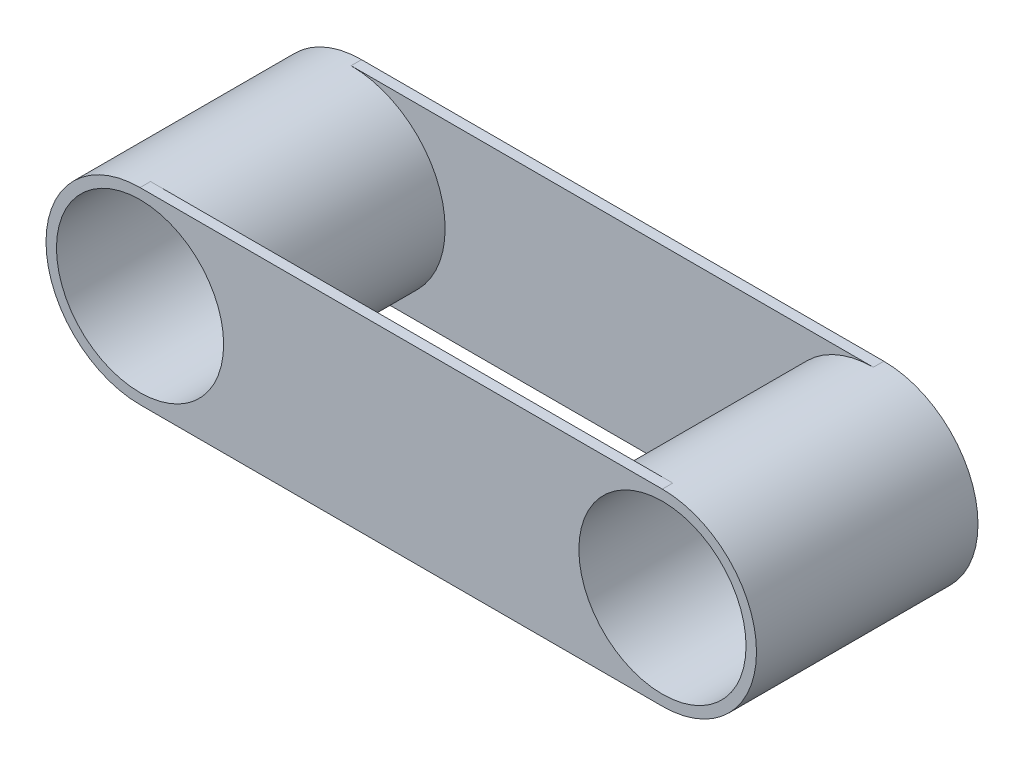
ISO-10303-21;
HEADER;
FILE_DESCRIPTION(('STEP AP214'),'2;1');
FILE_NAME('part.step','',(''),(''),'','','');
FILE_SCHEMA(('AUTOMOTIVE_DESIGN { 1 0 10303 214 1 1 1 1 }'));
ENDSEC;
DATA;
#1=APPLICATION_CONTEXT('core data for automotive mechanical design processes');
#2=APPLICATION_PROTOCOL_DEFINITION('international standard','automotive_design',2000,#1);
#3=PRODUCT_CONTEXT('',#1,'mechanical');
#4=PRODUCT('Part','Part','',(#3));
#5=PRODUCT_RELATED_PRODUCT_CATEGORY('part','',(#4));
#6=PRODUCT_DEFINITION_FORMATION('','',#4);
#7=PRODUCT_DEFINITION_CONTEXT('part definition',#1,'design');
#8=PRODUCT_DEFINITION('design','',#6,#7);
#9=PRODUCT_DEFINITION_SHAPE('','',#8);
#10=(LENGTH_UNIT() NAMED_UNIT(*) SI_UNIT(.MILLI.,.METRE.));
#11=(NAMED_UNIT(*) PLANE_ANGLE_UNIT() SI_UNIT($,.RADIAN.));
#12=(NAMED_UNIT(*) SI_UNIT($,.STERADIAN.) SOLID_ANGLE_UNIT());
#13=UNCERTAINTY_MEASURE_WITH_UNIT(LENGTH_MEASURE(1.E-05),#10,'distance_accuracy_value','');
#14=(GEOMETRIC_REPRESENTATION_CONTEXT(3) GLOBAL_UNCERTAINTY_ASSIGNED_CONTEXT((#13)) GLOBAL_UNIT_ASSIGNED_CONTEXT((#10,
#11,#12)) REPRESENTATION_CONTEXT('',''));
#15=CARTESIAN_POINT('',(0.,0.,0.));
#16=DIRECTION('',(0.,0.,1.));
#17=DIRECTION('',(1.,0.,0.));
#18=AXIS2_PLACEMENT_3D('',#15,#16,#17);
#19=CARTESIAN_POINT('',(499.88,90.,96.));
#20=DIRECTION('',(-1.,0.,0.));
#21=DIRECTION('',(0.,0.,1.));
#22=AXIS2_PLACEMENT_3D('',#19,#20,#21);
#23=PLANE('',#22);
#24=DIRECTION('',(0.,-1.,0.));
#25=VECTOR('',#24,1.);
#26=CARTESIAN_POINT('',(499.88,90.,106.));
#27=LINE('',#26,#25);
#28=CARTESIAN_POINT('',(499.88,90.,106.));
#29=VERTEX_POINT('',#28);
#30=CARTESIAN_POINT('',(499.88,89.9999199999645,106.));
#31=VERTEX_POINT('',#30);
#32=EDGE_CURVE('E59',#29,#31,#27,.T.);
#33=ORIENTED_EDGE('',*,*,#32,.T.);
#34=DIRECTION('',(0.,0.,-1.));
#35=VECTOR('',#34,1.);
#36=CARTESIAN_POINT('',(499.88,89.9999199999645,106.));
#37=LINE('',#36,#35);
#38=CARTESIAN_POINT('',(499.88,89.9999199999644,96.));
#39=VERTEX_POINT('',#38);
#40=EDGE_CURVE('E164',#31,#39,#37,.T.);
#41=ORIENTED_EDGE('',*,*,#40,.T.);
#42=DIRECTION('',(0.,-1.,0.));
#43=VECTOR('',#42,1.);
#44=CARTESIAN_POINT('',(499.88,90.,96.));
#45=LINE('',#44,#43);
#46=CARTESIAN_POINT('',(499.88,90.,96.));
#47=VERTEX_POINT('',#46);
#48=EDGE_CURVE('E182',#47,#39,#45,.T.);
#49=ORIENTED_EDGE('',*,*,#48,.F.);
#50=DIRECTION('',(0.,0.,1.));
#51=VECTOR('',#50,1.);
#52=CARTESIAN_POINT('',(499.88,90.,96.));
#53=LINE('',#52,#51);
#54=EDGE_CURVE('E197',#47,#29,#53,.T.);
#55=ORIENTED_EDGE('',*,*,#54,.T.);
#56=EDGE_LOOP('',(#33,#41,#49,#55));
#57=FACE_BOUND('',#56,.T.);
#58=ADVANCED_FACE('F36',(#57),#23,.F.);
#59=CARTESIAN_POINT('',(499.88,90.,-96.));
#60=DIRECTION('',(1.,0.,0.));
#61=DIRECTION('',(0.,0.,-1.));
#62=AXIS2_PLACEMENT_3D('',#59,#60,#61);
#63=PLANE('',#62);
#64=DIRECTION('',(0.,0.,-1.));
#65=VECTOR('',#64,1.);
#66=CARTESIAN_POINT('',(499.88,-89.9999199999645,106.));
#67=LINE('',#66,#65);
#68=CARTESIAN_POINT('',(499.88,-89.9999199999644,-96.));
#69=VERTEX_POINT('',#68);
#70=CARTESIAN_POINT('',(499.88,-89.9999199999644,-106.));
#71=VERTEX_POINT('',#70);
#72=EDGE_CURVE('E132',#69,#71,#67,.T.);
#73=ORIENTED_EDGE('',*,*,#72,.F.);
#74=DIRECTION('',(0.,-1.,0.));
#75=VECTOR('',#74,1.);
#76=CARTESIAN_POINT('',(499.88,90.,-96.));
#77=LINE('',#76,#75);
#78=CARTESIAN_POINT('',(499.88,-90.,-96.));
#79=VERTEX_POINT('',#78);
#80=EDGE_CURVE('E126',#69,#79,#77,.T.);
#81=ORIENTED_EDGE('',*,*,#80,.T.);
#82=DIRECTION('',(0.,0.,-1.));
#83=VECTOR('',#82,1.);
#84=CARTESIAN_POINT('',(499.88,-90.,-96.));
#85=LINE('',#84,#83);
#86=CARTESIAN_POINT('',(499.88,-90.,-106.));
#87=VERTEX_POINT('',#86);
#88=EDGE_CURVE('E129',#79,#87,#85,.T.);
#89=ORIENTED_EDGE('',*,*,#88,.T.);
#90=DIRECTION('',(0.,-1.,0.));
#91=VECTOR('',#90,1.);
#92=CARTESIAN_POINT('',(499.88,90.,-106.));
#93=LINE('',#92,#91);
#94=EDGE_CURVE('E163',#71,#87,#93,.T.);
#95=ORIENTED_EDGE('',*,*,#94,.F.);
#96=EDGE_LOOP('',(#73,#81,#89,#95));
#97=FACE_BOUND('',#96,.T.);
#98=ADVANCED_FACE('F128',(#97),#63,.T.);
#99=CARTESIAN_POINT('',(0.,0.,106.));
#100=DIRECTION('',(0.,0.,-1.));
#101=DIRECTION('',(-1.,0.,0.));
#102=AXIS2_PLACEMENT_3D('',#99,#100,#101);
#103=CYLINDRICAL_SURFACE('',#102,90.);
#104=CARTESIAN_POINT('',(0.,0.,106.));
#105=DIRECTION('',(0.,0.,1.));
#106=DIRECTION('',(1.,0.,0.));
#107=AXIS2_PLACEMENT_3D('',#104,#105,#106);
#108=CIRCLE('',#107,90.);
#109=CARTESIAN_POINT('',(0.,90.,106.));
#110=VERTEX_POINT('',#109);
#111=CARTESIAN_POINT('',(0.,-90.,106.));
#112=VERTEX_POINT('',#111);
#113=EDGE_CURVE('E44',#110,#112,#108,.T.);
#114=ORIENTED_EDGE('',*,*,#113,.F.);
#115=DIRECTION('',(0.,0.,1.));
#116=VECTOR('',#115,1.);
#117=CARTESIAN_POINT('',(0.,90.,96.));
#118=LINE('',#117,#116);
#119=CARTESIAN_POINT('',(0.,90.,96.));
#120=VERTEX_POINT('',#119);
#121=EDGE_CURVE('E199',#120,#110,#118,.T.);
#122=ORIENTED_EDGE('',*,*,#121,.F.);
#123=CARTESIAN_POINT('',(0.,0.,96.));
#124=DIRECTION('',(0.,0.,1.));
#125=DIRECTION('',(1.,0.,0.));
#126=AXIS2_PLACEMENT_3D('',#123,#124,#125);
#127=CIRCLE('',#126,90.);
#128=CARTESIAN_POINT('',(0.,-90.,96.));
#129=VERTEX_POINT('',#128);
#130=EDGE_CURVE('E175',#129,#120,#127,.T.);
#131=ORIENTED_EDGE('',*,*,#130,.F.);
#132=DIRECTION('',(0.,0.,1.));
#133=VECTOR('',#132,1.);
#134=CARTESIAN_POINT('',(0.,-90.,96.));
#135=LINE('',#134,#133);
#136=EDGE_CURVE('E187',#129,#112,#135,.T.);
#137=ORIENTED_EDGE('',*,*,#136,.T.);
#138=EDGE_LOOP('',(#114,#122,#131,#137));
#139=FACE_BOUND('',#138,.T.);
#140=DIRECTION('',(0.,0.,-1.));
#141=VECTOR('',#140,1.);
#142=CARTESIAN_POINT('',(0.,-90.,-96.));
#143=LINE('',#142,#141);
#144=CARTESIAN_POINT('',(0.,-90.,-96.));
#145=VERTEX_POINT('',#144);
#146=CARTESIAN_POINT('',(0.,-90.,-106.));
#147=VERTEX_POINT('',#146);
#148=EDGE_CURVE('E145',#145,#147,#143,.T.);
#149=ORIENTED_EDGE('',*,*,#148,.F.);
#150=CARTESIAN_POINT('',(0.,0.,-96.));
#151=DIRECTION('',(0.,0.,1.));
#152=DIRECTION('',(1.,0.,0.));
#153=AXIS2_PLACEMENT_3D('',#150,#151,#152);
#154=CIRCLE('',#153,90.);
#155=CARTESIAN_POINT('',(0.,90.,-96.));
#156=VERTEX_POINT('',#155);
#157=EDGE_CURVE('E151',#145,#156,#154,.T.);
#158=ORIENTED_EDGE('',*,*,#157,.T.);
#159=DIRECTION('',(0.,0.,-1.));
#160=VECTOR('',#159,1.);
#161=CARTESIAN_POINT('',(0.,90.,-96.));
#162=LINE('',#161,#160);
#163=CARTESIAN_POINT('',(0.,90.,-106.));
#164=VERTEX_POINT('',#163);
#165=EDGE_CURVE('E161',#156,#164,#162,.T.);
#166=ORIENTED_EDGE('',*,*,#165,.T.);
#167=CARTESIAN_POINT('',(0.,0.,-106.));
#168=DIRECTION('',(0.,0.,1.));
#169=DIRECTION('',(1.,0.,0.));
#170=AXIS2_PLACEMENT_3D('',#167,#168,#169);
#171=CIRCLE('',#170,90.);
#172=EDGE_CURVE('E205',#164,#147,#171,.T.);
#173=ORIENTED_EDGE('',*,*,#172,.T.);
#174=EDGE_LOOP('',(#149,#158,#166,#173));
#175=FACE_BOUND('',#174,.T.);
#176=ADVANCED_FACE('F38',(#139,#175),#103,.T.);
#177=CARTESIAN_POINT('',(0.,0.,106.));
#178=DIRECTION('',(0.,0.,1.));
#179=DIRECTION('',(1.,0.,0.));
#180=AXIS2_PLACEMENT_3D('',#177,#178,#179);
#181=PLANE('',#180);
#182=CARTESIAN_POINT('',(500.,0.,106.));
#183=DIRECTION('',(0.,0.,-1.));
#184=DIRECTION('',(-1.,0.,0.));
#185=AXIS2_PLACEMENT_3D('',#182,#183,#184);
#186=CIRCLE('',#185,80.);
#187=CARTESIAN_POINT('',(420.,0.,106.));
#188=VERTEX_POINT('',#187);
#189=EDGE_CURVE('E239',#188,#188,#186,.T.);
#190=ORIENTED_EDGE('',*,*,#189,.T.);
#191=EDGE_LOOP('',(#190));
#192=FACE_BOUND('',#191,.T.);
#193=CARTESIAN_POINT('',(499.88,-89.9999199999644,106.));
#194=VERTEX_POINT('',#193);
#195=CARTESIAN_POINT('',(499.88,-90.,106.));
#196=VERTEX_POINT('',#195);
#197=EDGE_CURVE('E189',#194,#196,#27,.T.);
#198=ORIENTED_EDGE('',*,*,#197,.F.);
#199=CARTESIAN_POINT('',(500.,0.,106.));
#200=DIRECTION('',(0.,0.,-1.));
#201=DIRECTION('',(-1.,0.,0.));
#202=AXIS2_PLACEMENT_3D('',#199,#200,#201);
#203=CIRCLE('',#202,90.);
#204=EDGE_CURVE('E226',#31,#194,#203,.T.);
#205=ORIENTED_EDGE('',*,*,#204,.F.);
#206=ORIENTED_EDGE('',*,*,#32,.F.);
#207=DIRECTION('',(1.,0.,0.));
#208=VECTOR('',#207,1.);
#209=CARTESIAN_POINT('',(0.,90.,106.));
#210=LINE('',#209,#208);
#211=EDGE_CURVE('E174',#110,#29,#210,.T.);
#212=ORIENTED_EDGE('',*,*,#211,.F.);
#213=ORIENTED_EDGE('',*,*,#113,.T.);
#214=DIRECTION('',(-1.,0.,0.));
#215=VECTOR('',#214,1.);
#216=CARTESIAN_POINT('',(499.88,-90.,106.));
#217=LINE('',#216,#215);
#218=EDGE_CURVE('E179',#196,#112,#217,.T.);
#219=ORIENTED_EDGE('',*,*,#218,.F.);
#220=EDGE_LOOP('',(#198,#205,#206,#212,#213,#219));
#221=FACE_BOUND('',#220,.T.);
#222=CARTESIAN_POINT('',(0.,0.,106.));
#223=DIRECTION('',(0.,0.,1.));
#224=DIRECTION('',(1.,0.,0.));
#225=AXIS2_PLACEMENT_3D('',#222,#223,#224);
#226=CIRCLE('',#225,80.);
#227=CARTESIAN_POINT('',(80.,0.,106.));
#228=VERTEX_POINT('',#227);
#229=EDGE_CURVE('E202',#228,#228,#226,.T.);
#230=ORIENTED_EDGE('',*,*,#229,.F.);
#231=EDGE_LOOP('',(#230));
#232=FACE_BOUND('',#231,.T.);
#233=ADVANCED_FACE('F247',(#192,#221,#232),#181,.T.);
#234=CARTESIAN_POINT('',(0.,0.,-106.));
#235=DIRECTION('',(0.,0.,1.));
#236=DIRECTION('',(1.,0.,0.));
#237=AXIS2_PLACEMENT_3D('',#234,#235,#236);
#238=PLANE('',#237);
#239=CARTESIAN_POINT('',(499.88,90.,-106.));
#240=VERTEX_POINT('',#239);
#241=CARTESIAN_POINT('',(499.88,89.9999199999645,-106.));
#242=VERTEX_POINT('',#241);
#243=EDGE_CURVE('E165',#240,#242,#93,.T.);
#244=ORIENTED_EDGE('',*,*,#243,.T.);
#245=CARTESIAN_POINT('',(500.,0.,-106.));
#246=DIRECTION('',(0.,0.,-1.));
#247=DIRECTION('',(-1.,0.,0.));
#248=AXIS2_PLACEMENT_3D('',#245,#246,#247);
#249=CIRCLE('',#248,90.);
#250=EDGE_CURVE('E217',#242,#71,#249,.T.);
#251=ORIENTED_EDGE('',*,*,#250,.T.);
#252=ORIENTED_EDGE('',*,*,#94,.T.);
#253=DIRECTION('',(-1.,0.,0.));
#254=VECTOR('',#253,1.);
#255=CARTESIAN_POINT('',(499.88,-90.,-106.));
#256=LINE('',#255,#254);
#257=EDGE_CURVE('E144',#87,#147,#256,.T.);
#258=ORIENTED_EDGE('',*,*,#257,.T.);
#259=ORIENTED_EDGE('',*,*,#172,.F.);
#260=DIRECTION('',(1.,0.,0.));
#261=VECTOR('',#260,1.);
#262=CARTESIAN_POINT('',(0.,90.,-106.));
#263=LINE('',#262,#261);
#264=EDGE_CURVE('E153',#164,#240,#263,.T.);
#265=ORIENTED_EDGE('',*,*,#264,.T.);
#266=EDGE_LOOP('',(#244,#251,#252,#258,#259,#265));
#267=FACE_BOUND('',#266,.T.);
#268=CARTESIAN_POINT('',(0.,0.,-106.));
#269=DIRECTION('',(0.,0.,1.));
#270=DIRECTION('',(1.,0.,0.));
#271=AXIS2_PLACEMENT_3D('',#268,#269,#270);
#272=CIRCLE('',#271,80.);
#273=CARTESIAN_POINT('',(80.,0.,-106.));
#274=VERTEX_POINT('',#273);
#275=EDGE_CURVE('E201',#274,#274,#272,.T.);
#276=ORIENTED_EDGE('',*,*,#275,.T.);
#277=EDGE_LOOP('',(#276));
#278=FACE_BOUND('',#277,.T.);
#279=CARTESIAN_POINT('',(500.,0.,-106.));
#280=DIRECTION('',(0.,0.,-1.));
#281=DIRECTION('',(-1.,0.,0.));
#282=AXIS2_PLACEMENT_3D('',#279,#280,#281);
#283=CIRCLE('',#282,80.);
#284=CARTESIAN_POINT('',(420.,0.,-106.));
#285=VERTEX_POINT('',#284);
#286=EDGE_CURVE('E241',#285,#285,#283,.T.);
#287=ORIENTED_EDGE('',*,*,#286,.F.);
#288=EDGE_LOOP('',(#287));
#289=FACE_BOUND('',#288,.T.);
#290=ADVANCED_FACE('F213',(#267,#278,#289),#238,.F.);
#291=CARTESIAN_POINT('',(0.,0.,106.));
#292=DIRECTION('',(0.,0.,-1.));
#293=DIRECTION('',(-1.,0.,0.));
#294=AXIS2_PLACEMENT_3D('',#291,#292,#293);
#295=CYLINDRICAL_SURFACE('',#294,80.);
#296=ORIENTED_EDGE('',*,*,#229,.T.);
#297=EDGE_LOOP('',(#296));
#298=FACE_BOUND('',#297,.T.);
#299=ORIENTED_EDGE('',*,*,#275,.F.);
#300=EDGE_LOOP('',(#299));
#301=FACE_BOUND('',#300,.T.);
#302=ADVANCED_FACE('F275',(#298,#301),#295,.F.);
#303=CARTESIAN_POINT('',(0.,90.,96.));
#304=DIRECTION('',(0.,-1.,0.));
#305=DIRECTION('',(0.,0.,-1.));
#306=AXIS2_PLACEMENT_3D('',#303,#304,#305);
#307=PLANE('',#306);
#308=ORIENTED_EDGE('',*,*,#211,.T.);
#309=ORIENTED_EDGE('',*,*,#54,.F.);
#310=DIRECTION('',(1.,0.,0.));
#311=VECTOR('',#310,1.);
#312=CARTESIAN_POINT('',(0.,90.,96.));
#313=LINE('',#312,#311);
#314=EDGE_CURVE('E178',#120,#47,#313,.T.);
#315=ORIENTED_EDGE('',*,*,#314,.F.);
#316=ORIENTED_EDGE('',*,*,#121,.T.);
#317=EDGE_LOOP('',(#308,#309,#315,#316));
#318=FACE_BOUND('',#317,.T.);
#319=ADVANCED_FACE('F269',(#318),#307,.F.);
#320=CARTESIAN_POINT('',(499.88,-89.9999199999644,96.));
#321=VERTEX_POINT('',#320);
#322=CARTESIAN_POINT('',(499.88,-90.,96.));
#323=VERTEX_POINT('',#322);
#324=EDGE_CURVE('E181',#321,#323,#45,.T.);
#325=ORIENTED_EDGE('',*,*,#324,.F.);
#326=DIRECTION('',(0.,0.,-1.));
#327=VECTOR('',#326,1.);
#328=CARTESIAN_POINT('',(499.88,-89.9999199999645,106.));
#329=LINE('',#328,#327);
#330=EDGE_CURVE('E51',#321,#194,#329,.F.);
#331=ORIENTED_EDGE('',*,*,#330,.T.);
#332=ORIENTED_EDGE('',*,*,#197,.T.);
#333=DIRECTION('',(0.,0.,1.));
#334=VECTOR('',#333,1.);
#335=CARTESIAN_POINT('',(499.88,-90.,96.));
#336=LINE('',#335,#334);
#337=EDGE_CURVE('E194',#323,#196,#336,.T.);
#338=ORIENTED_EDGE('',*,*,#337,.F.);
#339=EDGE_LOOP('',(#325,#331,#332,#338));
#340=FACE_BOUND('',#339,.T.);
#341=ADVANCED_FACE('F259',(#340),#23,.F.);
#342=CARTESIAN_POINT('',(499.88,-90.,96.));
#343=DIRECTION('',(0.,1.,0.));
#344=DIRECTION('',(-1.,0.,0.));
#345=AXIS2_PLACEMENT_3D('',#342,#343,#344);
#346=PLANE('',#345);
#347=ORIENTED_EDGE('',*,*,#218,.T.);
#348=ORIENTED_EDGE('',*,*,#136,.F.);
#349=DIRECTION('',(-1.,0.,0.));
#350=VECTOR('',#349,1.);
#351=CARTESIAN_POINT('',(499.88,-90.,96.));
#352=LINE('',#351,#350);
#353=EDGE_CURVE('E185',#323,#129,#352,.T.);
#354=ORIENTED_EDGE('',*,*,#353,.F.);
#355=ORIENTED_EDGE('',*,*,#337,.T.);
#356=EDGE_LOOP('',(#347,#348,#354,#355));
#357=FACE_BOUND('',#356,.T.);
#358=ADVANCED_FACE('F268',(#357),#346,.F.);
#359=CARTESIAN_POINT('',(0.,0.,96.));
#360=DIRECTION('',(0.,0.,1.));
#361=DIRECTION('',(1.,0.,0.));
#362=AXIS2_PLACEMENT_3D('',#359,#360,#361);
#363=PLANE('',#362);
#364=ORIENTED_EDGE('',*,*,#48,.T.);
#365=CARTESIAN_POINT('',(500.,0.,96.));
#366=DIRECTION('',(0.,0.,1.));
#367=DIRECTION('',(1.,0.,0.));
#368=AXIS2_PLACEMENT_3D('',#365,#366,#367);
#369=CIRCLE('',#368,90.);
#370=EDGE_CURVE('E222',#39,#321,#369,.T.);
#371=ORIENTED_EDGE('',*,*,#370,.T.);
#372=ORIENTED_EDGE('',*,*,#324,.T.);
#373=ORIENTED_EDGE('',*,*,#353,.T.);
#374=ORIENTED_EDGE('',*,*,#130,.T.);
#375=ORIENTED_EDGE('',*,*,#314,.T.);
#376=EDGE_LOOP('',(#364,#371,#372,#373,#374,#375));
#377=FACE_BOUND('',#376,.T.);
#378=ADVANCED_FACE('F235',(#377),#363,.F.);
#379=CARTESIAN_POINT('',(499.88,-90.,-96.));
#380=DIRECTION('',(0.,-1.,0.));
#381=DIRECTION('',(1.,0.,0.));
#382=AXIS2_PLACEMENT_3D('',#379,#380,#381);
#383=PLANE('',#382);
#384=ORIENTED_EDGE('',*,*,#257,.F.);
#385=ORIENTED_EDGE('',*,*,#88,.F.);
#386=DIRECTION('',(-1.,0.,0.));
#387=VECTOR('',#386,1.);
#388=CARTESIAN_POINT('',(499.88,-90.,-96.));
#389=LINE('',#388,#387);
#390=EDGE_CURVE('E137',#79,#145,#389,.T.);
#391=ORIENTED_EDGE('',*,*,#390,.T.);
#392=ORIENTED_EDGE('',*,*,#148,.T.);
#393=EDGE_LOOP('',(#384,#385,#391,#392));
#394=FACE_BOUND('',#393,.T.);
#395=ADVANCED_FACE('F141',(#394),#383,.T.);
#396=DIRECTION('',(0.,0.,-1.));
#397=VECTOR('',#396,1.);
#398=CARTESIAN_POINT('',(499.88,89.9999199999645,106.));
#399=LINE('',#398,#397);
#400=CARTESIAN_POINT('',(499.88,89.9999199999644,-96.));
#401=VERTEX_POINT('',#400);
#402=EDGE_CURVE('E223',#242,#401,#399,.F.);
#403=ORIENTED_EDGE('',*,*,#402,.F.);
#404=ORIENTED_EDGE('',*,*,#243,.F.);
#405=DIRECTION('',(0.,0.,-1.));
#406=VECTOR('',#405,1.);
#407=CARTESIAN_POINT('',(499.88,90.,-96.));
#408=LINE('',#407,#406);
#409=CARTESIAN_POINT('',(499.88,90.,-96.));
#410=VERTEX_POINT('',#409);
#411=EDGE_CURVE('E146',#410,#240,#408,.T.);
#412=ORIENTED_EDGE('',*,*,#411,.F.);
#413=EDGE_CURVE('E136',#410,#401,#77,.T.);
#414=ORIENTED_EDGE('',*,*,#413,.T.);
#415=EDGE_LOOP('',(#403,#404,#412,#414));
#416=FACE_BOUND('',#415,.T.);
#417=ADVANCED_FACE('F264',(#416),#63,.T.);
#418=CARTESIAN_POINT('',(0.,90.,-96.));
#419=DIRECTION('',(0.,1.,0.));
#420=DIRECTION('',(0.,0.,1.));
#421=AXIS2_PLACEMENT_3D('',#418,#419,#420);
#422=PLANE('',#421);
#423=ORIENTED_EDGE('',*,*,#264,.F.);
#424=ORIENTED_EDGE('',*,*,#165,.F.);
#425=DIRECTION('',(1.,0.,0.));
#426=VECTOR('',#425,1.);
#427=CARTESIAN_POINT('',(0.,90.,-96.));
#428=LINE('',#427,#426);
#429=EDGE_CURVE('E158',#156,#410,#428,.T.);
#430=ORIENTED_EDGE('',*,*,#429,.T.);
#431=ORIENTED_EDGE('',*,*,#411,.T.);
#432=EDGE_LOOP('',(#423,#424,#430,#431));
#433=FACE_BOUND('',#432,.T.);
#434=ADVANCED_FACE('F343',(#433),#422,.T.);
#435=CARTESIAN_POINT('',(0.,0.,-96.));
#436=DIRECTION('',(0.,0.,-1.));
#437=DIRECTION('',(1.,0.,0.));
#438=AXIS2_PLACEMENT_3D('',#435,#436,#437);
#439=PLANE('',#438);
#440=ORIENTED_EDGE('',*,*,#80,.F.);
#441=CARTESIAN_POINT('',(500.,0.,-96.));
#442=DIRECTION('',(0.,0.,-1.));
#443=DIRECTION('',(-1.,0.,0.));
#444=AXIS2_PLACEMENT_3D('',#441,#442,#443);
#445=CIRCLE('',#444,90.);
#446=EDGE_CURVE('E11',#69,#401,#445,.T.);
#447=ORIENTED_EDGE('',*,*,#446,.T.);
#448=ORIENTED_EDGE('',*,*,#413,.F.);
#449=ORIENTED_EDGE('',*,*,#429,.F.);
#450=ORIENTED_EDGE('',*,*,#157,.F.);
#451=ORIENTED_EDGE('',*,*,#390,.F.);
#452=EDGE_LOOP('',(#440,#447,#448,#449,#450,#451));
#453=FACE_BOUND('',#452,.T.);
#454=ADVANCED_FACE('F149',(#453),#439,.F.);
#455=CARTESIAN_POINT('',(500.,0.,106.));
#456=DIRECTION('',(0.,0.,-1.));
#457=DIRECTION('',(-1.,0.,0.));
#458=AXIS2_PLACEMENT_3D('',#455,#456,#457);
#459=CYLINDRICAL_SURFACE('',#458,90.);
#460=ORIENTED_EDGE('',*,*,#446,.F.);
#461=ORIENTED_EDGE('',*,*,#72,.T.);
#462=ORIENTED_EDGE('',*,*,#250,.F.);
#463=ORIENTED_EDGE('',*,*,#402,.T.);
#464=EDGE_LOOP('',(#460,#461,#462,#463));
#465=FACE_BOUND('',#464,.T.);
#466=ORIENTED_EDGE('',*,*,#40,.F.);
#467=ORIENTED_EDGE('',*,*,#204,.T.);
#468=ORIENTED_EDGE('',*,*,#330,.F.);
#469=ORIENTED_EDGE('',*,*,#370,.F.);
#470=EDGE_LOOP('',(#466,#467,#468,#469));
#471=FACE_BOUND('',#470,.T.);
#472=ADVANCED_FACE('F219',(#465,#471),#459,.T.);
#473=CARTESIAN_POINT('',(500.,0.,106.));
#474=DIRECTION('',(0.,0.,-1.));
#475=DIRECTION('',(-1.,0.,0.));
#476=AXIS2_PLACEMENT_3D('',#473,#474,#475);
#477=CYLINDRICAL_SURFACE('',#476,80.);
#478=ORIENTED_EDGE('',*,*,#286,.T.);
#479=EDGE_LOOP('',(#478));
#480=FACE_BOUND('',#479,.T.);
#481=ORIENTED_EDGE('',*,*,#189,.F.);
#482=EDGE_LOOP('',(#481));
#483=FACE_BOUND('',#482,.T.);
#484=ADVANCED_FACE('F249',(#480,#483),#477,.F.);
#485=CLOSED_SHELL('',(#58,#98,#176,#233,#290,#302,#319,#341,#358,#378,#395,#417,#434,#454,#472,#484));
#486=MANIFOLD_SOLID_BREP('B2',#485);
#487=ADVANCED_BREP_SHAPE_REPRESENTATION('',(#18,#486),#14);
#488=SHAPE_DEFINITION_REPRESENTATION(#9,#487);
ENDSEC;
END-ISO-10303-21;
